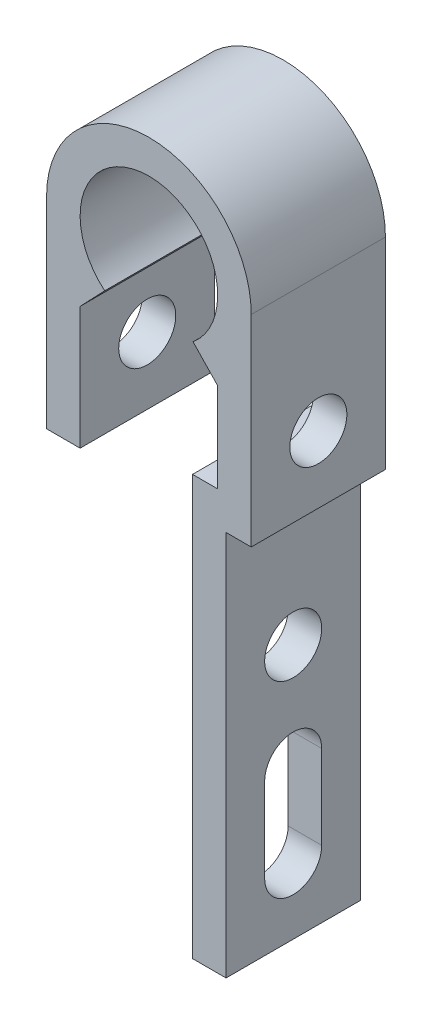
ISO-10303-21;
HEADER;
FILE_DESCRIPTION(('STEP AP214'),'2;1');
FILE_NAME('part.step','',(''),(''),'','','');
FILE_SCHEMA(('AUTOMOTIVE_DESIGN { 1 0 10303 214 1 1 1 1 }'));
ENDSEC;
DATA;
#1=APPLICATION_CONTEXT('core data for automotive mechanical design processes');
#2=APPLICATION_PROTOCOL_DEFINITION('international standard','automotive_design',2000,#1);
#3=PRODUCT_CONTEXT('',#1,'mechanical');
#4=PRODUCT('Part','Part','',(#3));
#5=PRODUCT_RELATED_PRODUCT_CATEGORY('part','',(#4));
#6=PRODUCT_DEFINITION_FORMATION('','',#4);
#7=PRODUCT_DEFINITION_CONTEXT('part definition',#1,'design');
#8=PRODUCT_DEFINITION('design','',#6,#7);
#9=PRODUCT_DEFINITION_SHAPE('','',#8);
#10=(LENGTH_UNIT() NAMED_UNIT(*) SI_UNIT(.MILLI.,.METRE.));
#11=(NAMED_UNIT(*) PLANE_ANGLE_UNIT() SI_UNIT($,.RADIAN.));
#12=(NAMED_UNIT(*) SI_UNIT($,.STERADIAN.) SOLID_ANGLE_UNIT());
#13=UNCERTAINTY_MEASURE_WITH_UNIT(LENGTH_MEASURE(1.E-05),#10,'distance_accuracy_value','');
#14=(GEOMETRIC_REPRESENTATION_CONTEXT(3) GLOBAL_UNCERTAINTY_ASSIGNED_CONTEXT((#13)) GLOBAL_UNIT_ASSIGNED_CONTEXT((#10,
#11,#12)) REPRESENTATION_CONTEXT('',''));
#15=CARTESIAN_POINT('',(0.,0.,0.));
#16=DIRECTION('',(0.,0.,1.));
#17=DIRECTION('',(1.,0.,0.));
#18=AXIS2_PLACEMENT_3D('',#15,#16,#17);
#19=CARTESIAN_POINT('',(-4.1,-12.,8.));
#20=DIRECTION('',(-1.,0.,0.));
#21=DIRECTION('',(0.,0.,1.));
#22=AXIS2_PLACEMENT_3D('',#19,#20,#21);
#23=PLANE('',#22);
#24=CARTESIAN_POINT('',(-4.1,-8.,4.));
#25=DIRECTION('',(-1.,0.,0.));
#26=DIRECTION('',(0.,0.,1.));
#27=AXIS2_PLACEMENT_3D('',#24,#25,#26);
#28=CIRCLE('',#27,1.7);
#29=CARTESIAN_POINT('',(-4.1,-8.,5.7));
#30=VERTEX_POINT('',#29);
#31=EDGE_CURVE('E251',#30,#30,#28,.T.);
#32=ORIENTED_EDGE('',*,*,#31,.T.);
#33=EDGE_LOOP('',(#32));
#34=FACE_BOUND('',#33,.T.);
#35=DIRECTION('',(0.,1.,0.));
#36=VECTOR('',#35,1.);
#37=CARTESIAN_POINT('',(-4.1,-12.,0.));
#38=LINE('',#37,#36);
#39=CARTESIAN_POINT('',(-4.1,-12.,0.));
#40=VERTEX_POINT('',#39);
#41=CARTESIAN_POINT('',(-4.1,-4.67694508196814,0.));
#42=VERTEX_POINT('',#41);
#43=EDGE_CURVE('E248',#40,#42,#38,.T.);
#44=ORIENTED_EDGE('',*,*,#43,.T.);
#45=DIRECTION('',(0.,0.,-1.));
#46=VECTOR('',#45,1.);
#47=CARTESIAN_POINT('',(-4.1,-4.67694508196814,8.));
#48=LINE('',#47,#46);
#49=CARTESIAN_POINT('',(-4.1,-4.67694508196814,8.));
#50=VERTEX_POINT('',#49);
#51=EDGE_CURVE('E160',#50,#42,#48,.T.);
#52=ORIENTED_EDGE('',*,*,#51,.F.);
#53=DIRECTION('',(0.,1.,0.));
#54=VECTOR('',#53,1.);
#55=CARTESIAN_POINT('',(-4.1,-12.,8.));
#56=LINE('',#55,#54);
#57=CARTESIAN_POINT('',(-4.1,-12.,8.));
#58=VERTEX_POINT('',#57);
#59=EDGE_CURVE('E223',#58,#50,#56,.T.);
#60=ORIENTED_EDGE('',*,*,#59,.F.);
#61=DIRECTION('',(0.,0.,-1.));
#62=VECTOR('',#61,1.);
#63=CARTESIAN_POINT('',(-4.1,-12.,8.));
#64=LINE('',#63,#62);
#65=EDGE_CURVE('E217',#58,#40,#64,.T.);
#66=ORIENTED_EDGE('',*,*,#65,.T.);
#67=EDGE_LOOP('',(#44,#52,#60,#66));
#68=FACE_BOUND('',#67,.T.);
#69=ADVANCED_FACE('F33',(#34,#68),#23,.F.);
#70=CARTESIAN_POINT('',(-2.63542919971482,-3.14078221678781,8.));
#71=DIRECTION('',(-0.723771106305428,0.690040133381687,0.));
#72=DIRECTION('',(-0.690040133381687,-0.723771106305428,0.));
#73=AXIS2_PLACEMENT_3D('',#70,#71,#72);
#74=PLANE('',#73);
#75=DIRECTION('',(0.690040133381687,0.723771106305428,0.));
#76=VECTOR('',#75,1.);
#77=CARTESIAN_POINT('',(-2.63542919971482,-3.14078221678781,0.));
#78=LINE('',#77,#76);
#79=CARTESIAN_POINT('',(-2.63542919971481,-3.14078221678781,0.));
#80=VERTEX_POINT('',#79);
#81=EDGE_CURVE('E246',#42,#80,#78,.T.);
#82=ORIENTED_EDGE('',*,*,#81,.T.);
#83=DIRECTION('',(0.,0.,-1.));
#84=VECTOR('',#83,1.);
#85=CARTESIAN_POINT('',(-2.63542919971481,-3.14078221678781,8.));
#86=LINE('',#85,#84);
#87=CARTESIAN_POINT('',(-2.63542919971481,-3.14078221678781,8.));
#88=VERTEX_POINT('',#87);
#89=EDGE_CURVE('E181',#88,#80,#86,.T.);
#90=ORIENTED_EDGE('',*,*,#89,.F.);
#91=DIRECTION('',(0.690040133381687,0.723771106305428,0.));
#92=VECTOR('',#91,1.);
#93=CARTESIAN_POINT('',(-2.63542919971482,-3.14078221678781,8.));
#94=LINE('',#93,#92);
#95=EDGE_CURVE('E275',#50,#88,#94,.T.);
#96=ORIENTED_EDGE('',*,*,#95,.F.);
#97=ORIENTED_EDGE('',*,*,#51,.T.);
#98=EDGE_LOOP('',(#82,#90,#96,#97));
#99=FACE_BOUND('',#98,.T.);
#100=ADVANCED_FACE('F323',(#99),#74,.F.);
#101=CARTESIAN_POINT('',(0.,0.,8.));
#102=DIRECTION('',(0.,0.,-1.));
#103=DIRECTION('',(-1.,0.,0.));
#104=AXIS2_PLACEMENT_3D('',#101,#102,#103);
#105=CYLINDRICAL_SURFACE('',#104,4.1);
#106=CARTESIAN_POINT('',(0.,0.,0.));
#107=DIRECTION('',(0.,0.,-1.));
#108=DIRECTION('',(-1.,0.,0.));
#109=AXIS2_PLACEMENT_3D('',#106,#107,#108);
#110=CIRCLE('',#109,4.1);
#111=CARTESIAN_POINT('',(2.63542919971482,-3.14078221678781,0.));
#112=VERTEX_POINT('',#111);
#113=EDGE_CURVE('E244',#80,#112,#110,.T.);
#114=ORIENTED_EDGE('',*,*,#113,.T.);
#115=DIRECTION('',(0.,0.,-1.));
#116=VECTOR('',#115,1.);
#117=CARTESIAN_POINT('',(2.63542919971482,-3.14078221678781,8.));
#118=LINE('',#117,#116);
#119=CARTESIAN_POINT('',(2.63542919971482,-3.14078221678781,8.));
#120=VERTEX_POINT('',#119);
#121=EDGE_CURVE('E184',#120,#112,#118,.T.);
#122=ORIENTED_EDGE('',*,*,#121,.F.);
#123=CARTESIAN_POINT('',(0.,0.,8.));
#124=DIRECTION('',(0.,0.,-1.));
#125=DIRECTION('',(-1.,0.,0.));
#126=AXIS2_PLACEMENT_3D('',#123,#124,#125);
#127=CIRCLE('',#126,4.1);
#128=EDGE_CURVE('E273',#88,#120,#127,.T.);
#129=ORIENTED_EDGE('',*,*,#128,.F.);
#130=ORIENTED_EDGE('',*,*,#89,.T.);
#131=EDGE_LOOP('',(#114,#122,#129,#130));
#132=FACE_BOUND('',#131,.T.);
#133=ADVANCED_FACE('F328',(#132),#105,.F.);
#134=CARTESIAN_POINT('',(4.1,-4.67694508196814,8.));
#135=DIRECTION('',(0.723771106305428,0.690040133381687,0.));
#136=DIRECTION('',(-0.690040133381688,0.723771106305428,0.));
#137=AXIS2_PLACEMENT_3D('',#134,#135,#136);
#138=PLANE('',#137);
#139=DIRECTION('',(0.690040133381687,-0.723771106305428,0.));
#140=VECTOR('',#139,1.);
#141=CARTESIAN_POINT('',(4.1,-4.67694508196814,0.));
#142=LINE('',#141,#140);
#143=CARTESIAN_POINT('',(4.1,-4.67694508196814,0.));
#144=VERTEX_POINT('',#143);
#145=EDGE_CURVE('E242',#112,#144,#142,.T.);
#146=ORIENTED_EDGE('',*,*,#145,.T.);
#147=DIRECTION('',(0.,0.,-1.));
#148=VECTOR('',#147,1.);
#149=CARTESIAN_POINT('',(4.1,-4.67694508196814,8.));
#150=LINE('',#149,#148);
#151=CARTESIAN_POINT('',(4.1,-4.67694508196814,8.));
#152=VERTEX_POINT('',#151);
#153=EDGE_CURVE('E187',#152,#144,#150,.T.);
#154=ORIENTED_EDGE('',*,*,#153,.F.);
#155=DIRECTION('',(0.690040133381687,-0.723771106305428,0.));
#156=VECTOR('',#155,1.);
#157=CARTESIAN_POINT('',(4.1,-4.67694508196814,8.));
#158=LINE('',#157,#156);
#159=EDGE_CURVE('E271',#120,#152,#158,.T.);
#160=ORIENTED_EDGE('',*,*,#159,.F.);
#161=ORIENTED_EDGE('',*,*,#121,.T.);
#162=EDGE_LOOP('',(#146,#154,#160,#161));
#163=FACE_BOUND('',#162,.T.);
#164=ADVANCED_FACE('F392',(#163),#138,.F.);
#165=CARTESIAN_POINT('',(4.1,-4.67694508196814,8.));
#166=DIRECTION('',(1.,0.,0.));
#167=DIRECTION('',(0.,1.,0.));
#168=AXIS2_PLACEMENT_3D('',#165,#166,#167);
#169=PLANE('',#168);
#170=CARTESIAN_POINT('',(4.1,-8.,4.));
#171=DIRECTION('',(1.,0.,0.));
#172=DIRECTION('',(0.,1.,0.));
#173=AXIS2_PLACEMENT_3D('',#170,#171,#172);
#174=CIRCLE('',#173,1.7);
#175=CARTESIAN_POINT('',(4.1,-6.3,4.));
#176=VERTEX_POINT('',#175);
#177=EDGE_CURVE('E281',#176,#176,#174,.T.);
#178=ORIENTED_EDGE('',*,*,#177,.T.);
#179=EDGE_LOOP('',(#178));
#180=FACE_BOUND('',#179,.T.);
#181=DIRECTION('',(0.,-1.,0.));
#182=VECTOR('',#181,1.);
#183=CARTESIAN_POINT('',(4.1,-4.67694508196814,0.));
#184=LINE('',#183,#182);
#185=CARTESIAN_POINT('',(4.1,-10.,0.));
#186=VERTEX_POINT('',#185);
#187=EDGE_CURVE('E240',#144,#186,#184,.T.);
#188=ORIENTED_EDGE('',*,*,#187,.T.);
#189=DIRECTION('',(0.,0.,-1.));
#190=VECTOR('',#189,1.);
#191=CARTESIAN_POINT('',(4.1,-10.,8.));
#192=LINE('',#191,#190);
#193=CARTESIAN_POINT('',(4.1,-10.,8.));
#194=VERTEX_POINT('',#193);
#195=EDGE_CURVE('E190',#194,#186,#192,.T.);
#196=ORIENTED_EDGE('',*,*,#195,.F.);
#197=DIRECTION('',(0.,-1.,0.));
#198=VECTOR('',#197,1.);
#199=CARTESIAN_POINT('',(4.1,-4.67694508196814,8.));
#200=LINE('',#199,#198);
#201=EDGE_CURVE('E269',#152,#194,#200,.T.);
#202=ORIENTED_EDGE('',*,*,#201,.F.);
#203=ORIENTED_EDGE('',*,*,#153,.T.);
#204=EDGE_LOOP('',(#188,#196,#202,#203));
#205=FACE_BOUND('',#204,.T.);
#206=ADVANCED_FACE('F388',(#180,#205),#169,.F.);
#207=CARTESIAN_POINT('',(4.1,-10.,8.));
#208=DIRECTION('',(0.,-1.,0.));
#209=DIRECTION('',(0.,0.,-1.));
#210=AXIS2_PLACEMENT_3D('',#207,#208,#209);
#211=PLANE('',#210);
#212=DIRECTION('',(-1.,0.,0.));
#213=VECTOR('',#212,1.);
#214=CARTESIAN_POINT('',(4.1,-10.,0.));
#215=LINE('',#214,#213);
#216=CARTESIAN_POINT('',(2.6,-10.,0.));
#217=VERTEX_POINT('',#216);
#218=EDGE_CURVE('E238',#186,#217,#215,.T.);
#219=ORIENTED_EDGE('',*,*,#218,.T.);
#220=DIRECTION('',(0.,0.,-1.));
#221=VECTOR('',#220,1.);
#222=CARTESIAN_POINT('',(2.6,-10.,8.));
#223=LINE('',#222,#221);
#224=CARTESIAN_POINT('',(2.6,-10.,8.));
#225=VERTEX_POINT('',#224);
#226=EDGE_CURVE('E193',#225,#217,#223,.T.);
#227=ORIENTED_EDGE('',*,*,#226,.F.);
#228=DIRECTION('',(-1.,0.,0.));
#229=VECTOR('',#228,1.);
#230=CARTESIAN_POINT('',(4.1,-10.,8.));
#231=LINE('',#230,#229);
#232=EDGE_CURVE('E267',#194,#225,#231,.T.);
#233=ORIENTED_EDGE('',*,*,#232,.F.);
#234=ORIENTED_EDGE('',*,*,#195,.T.);
#235=EDGE_LOOP('',(#219,#227,#233,#234));
#236=FACE_BOUND('',#235,.T.);
#237=ADVANCED_FACE('F383',(#236),#211,.F.);
#238=CARTESIAN_POINT('',(2.6,-10.,8.));
#239=DIRECTION('',(1.,0.,0.));
#240=DIRECTION('',(0.,1.,0.));
#241=AXIS2_PLACEMENT_3D('',#238,#239,#240);
#242=PLANE('',#241);
#243=CARTESIAN_POINT('',(2.6,-19.8,4.));
#244=DIRECTION('',(1.,0.,0.));
#245=DIRECTION('',(0.,1.,0.));
#246=AXIS2_PLACEMENT_3D('',#243,#244,#245);
#247=CIRCLE('',#246,1.7);
#248=CARTESIAN_POINT('',(2.6,-18.1,4.));
#249=VERTEX_POINT('',#248);
#250=EDGE_CURVE('E288',#249,#249,#247,.T.);
#251=ORIENTED_EDGE('',*,*,#250,.T.);
#252=EDGE_LOOP('',(#251));
#253=FACE_BOUND('',#252,.T.);
#254=DIRECTION('',(0.,1.,0.));
#255=VECTOR('',#254,1.);
#256=CARTESIAN_POINT('',(2.6,-10.,2.3));
#257=LINE('',#256,#255);
#258=CARTESIAN_POINT('',(2.6,-31.,2.3));
#259=VERTEX_POINT('',#258);
#260=CARTESIAN_POINT('',(2.6,-26.,2.3));
#261=VERTEX_POINT('',#260);
#262=EDGE_CURVE('E300',#259,#261,#257,.T.);
#263=ORIENTED_EDGE('',*,*,#262,.T.);
#264=CARTESIAN_POINT('',(2.6,-26.,4.));
#265=DIRECTION('',(1.,0.,0.));
#266=DIRECTION('',(0.,1.,0.));
#267=AXIS2_PLACEMENT_3D('',#264,#265,#266);
#268=CIRCLE('',#267,1.7);
#269=CARTESIAN_POINT('',(2.6,-26.,5.7));
#270=VERTEX_POINT('',#269);
#271=EDGE_CURVE('E167',#261,#270,#268,.T.);
#272=ORIENTED_EDGE('',*,*,#271,.T.);
#273=DIRECTION('',(0.,-1.,0.));
#274=VECTOR('',#273,1.);
#275=CARTESIAN_POINT('',(2.6,-10.,5.69999999999999));
#276=LINE('',#275,#274);
#277=CARTESIAN_POINT('',(2.6,-31.,5.7));
#278=VERTEX_POINT('',#277);
#279=EDGE_CURVE('E294',#270,#278,#276,.T.);
#280=ORIENTED_EDGE('',*,*,#279,.T.);
#281=CARTESIAN_POINT('',(2.6,-31.,4.));
#282=DIRECTION('',(1.,0.,0.));
#283=DIRECTION('',(0.,1.,0.));
#284=AXIS2_PLACEMENT_3D('',#281,#282,#283);
#285=CIRCLE('',#284,1.7);
#286=EDGE_CURVE('E297',#278,#259,#285,.T.);
#287=ORIENTED_EDGE('',*,*,#286,.T.);
#288=EDGE_LOOP('',(#263,#272,#280,#287));
#289=FACE_BOUND('',#288,.T.);
#290=DIRECTION('',(0.,-1.,0.));
#291=VECTOR('',#290,1.);
#292=CARTESIAN_POINT('',(2.6,-10.,0.));
#293=LINE('',#292,#291);
#294=CARTESIAN_POINT('',(2.6,-35.,0.));
#295=VERTEX_POINT('',#294);
#296=EDGE_CURVE('E236',#217,#295,#293,.T.);
#297=ORIENTED_EDGE('',*,*,#296,.T.);
#298=DIRECTION('',(0.,0.,-1.));
#299=VECTOR('',#298,1.);
#300=CARTESIAN_POINT('',(2.6,-35.,8.));
#301=LINE('',#300,#299);
#302=CARTESIAN_POINT('',(2.6,-35.,8.));
#303=VERTEX_POINT('',#302);
#304=EDGE_CURVE('E196',#303,#295,#301,.T.);
#305=ORIENTED_EDGE('',*,*,#304,.F.);
#306=DIRECTION('',(0.,-1.,0.));
#307=VECTOR('',#306,1.);
#308=CARTESIAN_POINT('',(2.6,-10.,8.));
#309=LINE('',#308,#307);
#310=EDGE_CURVE('E265',#225,#303,#309,.T.);
#311=ORIENTED_EDGE('',*,*,#310,.F.);
#312=ORIENTED_EDGE('',*,*,#226,.T.);
#313=EDGE_LOOP('',(#297,#305,#311,#312));
#314=FACE_BOUND('',#313,.T.);
#315=ADVANCED_FACE('F307',(#253,#289,#314),#242,.F.);
#316=CARTESIAN_POINT('',(2.6,-35.,8.));
#317=DIRECTION('',(0.,1.,0.));
#318=DIRECTION('',(0.,0.,1.));
#319=AXIS2_PLACEMENT_3D('',#316,#317,#318);
#320=PLANE('',#319);
#321=DIRECTION('',(1.,0.,0.));
#322=VECTOR('',#321,1.);
#323=CARTESIAN_POINT('',(2.6,-35.,0.));
#324=LINE('',#323,#322);
#325=CARTESIAN_POINT('',(4.6,-35.,0.));
#326=VERTEX_POINT('',#325);
#327=EDGE_CURVE('E234',#295,#326,#324,.T.);
#328=ORIENTED_EDGE('',*,*,#327,.T.);
#329=DIRECTION('',(0.,0.,-1.));
#330=VECTOR('',#329,1.);
#331=CARTESIAN_POINT('',(4.6,-35.,8.));
#332=LINE('',#331,#330);
#333=CARTESIAN_POINT('',(4.6,-35.,8.));
#334=VERTEX_POINT('',#333);
#335=EDGE_CURVE('E199',#334,#326,#332,.T.);
#336=ORIENTED_EDGE('',*,*,#335,.F.);
#337=DIRECTION('',(1.,0.,0.));
#338=VECTOR('',#337,1.);
#339=CARTESIAN_POINT('',(2.6,-35.,8.));
#340=LINE('',#339,#338);
#341=EDGE_CURVE('E263',#303,#334,#340,.T.);
#342=ORIENTED_EDGE('',*,*,#341,.F.);
#343=ORIENTED_EDGE('',*,*,#304,.T.);
#344=EDGE_LOOP('',(#328,#336,#342,#343));
#345=FACE_BOUND('',#344,.T.);
#346=ADVANCED_FACE('F376',(#345),#320,.F.);
#347=CARTESIAN_POINT('',(4.6,-12.,8.));
#348=DIRECTION('',(-1.,0.,0.));
#349=DIRECTION('',(0.,-1.,0.));
#350=AXIS2_PLACEMENT_3D('',#347,#348,#349);
#351=PLANE('',#350);
#352=CARTESIAN_POINT('',(4.6,-19.8,4.));
#353=DIRECTION('',(-1.,0.,0.));
#354=DIRECTION('',(0.,-1.,0.));
#355=AXIS2_PLACEMENT_3D('',#352,#353,#354);
#356=CIRCLE('',#355,1.7);
#357=CARTESIAN_POINT('',(4.6,-21.5,4.));
#358=VERTEX_POINT('',#357);
#359=EDGE_CURVE('E36',#358,#358,#356,.T.);
#360=ORIENTED_EDGE('',*,*,#359,.T.);
#361=EDGE_LOOP('',(#360));
#362=FACE_BOUND('',#361,.T.);
#363=DIRECTION('',(0.,1.,0.));
#364=VECTOR('',#363,1.);
#365=CARTESIAN_POINT('',(4.6,-12.,5.69999999999999));
#366=LINE('',#365,#364);
#367=CARTESIAN_POINT('',(4.6,-31.,5.7));
#368=VERTEX_POINT('',#367);
#369=CARTESIAN_POINT('',(4.6,-26.,5.7));
#370=VERTEX_POINT('',#369);
#371=EDGE_CURVE('E41',#368,#370,#366,.T.);
#372=ORIENTED_EDGE('',*,*,#371,.T.);
#373=CARTESIAN_POINT('',(4.6,-26.,4.));
#374=DIRECTION('',(-1.,0.,0.));
#375=DIRECTION('',(0.,-1.,0.));
#376=AXIS2_PLACEMENT_3D('',#373,#374,#375);
#377=CIRCLE('',#376,1.7);
#378=CARTESIAN_POINT('',(4.6,-26.,2.3));
#379=VERTEX_POINT('',#378);
#380=EDGE_CURVE('E11',#370,#379,#377,.T.);
#381=ORIENTED_EDGE('',*,*,#380,.T.);
#382=DIRECTION('',(0.,-1.,0.));
#383=VECTOR('',#382,1.);
#384=CARTESIAN_POINT('',(4.6,-12.,2.3));
#385=LINE('',#384,#383);
#386=CARTESIAN_POINT('',(4.6,-31.,2.3));
#387=VERTEX_POINT('',#386);
#388=EDGE_CURVE('E155',#379,#387,#385,.T.);
#389=ORIENTED_EDGE('',*,*,#388,.T.);
#390=CARTESIAN_POINT('',(4.6,-31.,4.));
#391=DIRECTION('',(-1.,0.,0.));
#392=DIRECTION('',(0.,-1.,0.));
#393=AXIS2_PLACEMENT_3D('',#390,#391,#392);
#394=CIRCLE('',#393,1.7);
#395=EDGE_CURVE('E159',#387,#368,#394,.T.);
#396=ORIENTED_EDGE('',*,*,#395,.T.);
#397=EDGE_LOOP('',(#372,#381,#389,#396));
#398=FACE_BOUND('',#397,.T.);
#399=DIRECTION('',(0.,1.,0.));
#400=VECTOR('',#399,1.);
#401=CARTESIAN_POINT('',(4.6,-12.,0.));
#402=LINE('',#401,#400);
#403=CARTESIAN_POINT('',(4.6,-12.,0.));
#404=VERTEX_POINT('',#403);
#405=EDGE_CURVE('E232',#326,#404,#402,.T.);
#406=ORIENTED_EDGE('',*,*,#405,.T.);
#407=DIRECTION('',(0.,0.,-1.));
#408=VECTOR('',#407,1.);
#409=CARTESIAN_POINT('',(4.6,-12.,8.));
#410=LINE('',#409,#408);
#411=CARTESIAN_POINT('',(4.6,-12.,8.));
#412=VERTEX_POINT('',#411);
#413=EDGE_CURVE('E202',#412,#404,#410,.T.);
#414=ORIENTED_EDGE('',*,*,#413,.F.);
#415=DIRECTION('',(0.,1.,0.));
#416=VECTOR('',#415,1.);
#417=CARTESIAN_POINT('',(4.6,-12.,8.));
#418=LINE('',#417,#416);
#419=EDGE_CURVE('E261',#334,#412,#418,.T.);
#420=ORIENTED_EDGE('',*,*,#419,.F.);
#421=ORIENTED_EDGE('',*,*,#335,.T.);
#422=EDGE_LOOP('',(#406,#414,#420,#421));
#423=FACE_BOUND('',#422,.T.);
#424=ADVANCED_FACE('F171',(#362,#398,#423),#351,.F.);
#425=CARTESIAN_POINT('',(6.1,-12.,8.));
#426=DIRECTION('',(0.,1.,0.));
#427=DIRECTION('',(0.,0.,1.));
#428=AXIS2_PLACEMENT_3D('',#425,#426,#427);
#429=PLANE('',#428);
#430=DIRECTION('',(1.,0.,0.));
#431=VECTOR('',#430,1.);
#432=CARTESIAN_POINT('',(6.1,-12.,0.));
#433=LINE('',#432,#431);
#434=CARTESIAN_POINT('',(6.1,-12.,0.));
#435=VERTEX_POINT('',#434);
#436=EDGE_CURVE('E230',#404,#435,#433,.T.);
#437=ORIENTED_EDGE('',*,*,#436,.T.);
#438=DIRECTION('',(0.,0.,-1.));
#439=VECTOR('',#438,1.);
#440=CARTESIAN_POINT('',(6.1,-12.,8.));
#441=LINE('',#440,#439);
#442=CARTESIAN_POINT('',(6.1,-12.,8.));
#443=VERTEX_POINT('',#442);
#444=EDGE_CURVE('E205',#443,#435,#441,.T.);
#445=ORIENTED_EDGE('',*,*,#444,.F.);
#446=DIRECTION('',(1.,0.,0.));
#447=VECTOR('',#446,1.);
#448=CARTESIAN_POINT('',(6.1,-12.,8.));
#449=LINE('',#448,#447);
#450=EDGE_CURVE('E259',#412,#443,#449,.T.);
#451=ORIENTED_EDGE('',*,*,#450,.F.);
#452=ORIENTED_EDGE('',*,*,#413,.T.);
#453=EDGE_LOOP('',(#437,#445,#451,#452));
#454=FACE_BOUND('',#453,.T.);
#455=ADVANCED_FACE('F367',(#454),#429,.F.);
#456=CARTESIAN_POINT('',(6.1,0.,8.));
#457=DIRECTION('',(-1.,0.,0.));
#458=DIRECTION('',(0.,0.,1.));
#459=AXIS2_PLACEMENT_3D('',#456,#457,#458);
#460=PLANE('',#459);
#461=CARTESIAN_POINT('',(6.1,-8.,4.));
#462=DIRECTION('',(-1.,0.,0.));
#463=DIRECTION('',(0.,0.,1.));
#464=AXIS2_PLACEMENT_3D('',#461,#462,#463);
#465=CIRCLE('',#464,1.7);
#466=CARTESIAN_POINT('',(6.1,-8.,5.7));
#467=VERTEX_POINT('',#466);
#468=EDGE_CURVE('E284',#467,#467,#465,.T.);
#469=ORIENTED_EDGE('',*,*,#468,.T.);
#470=EDGE_LOOP('',(#469));
#471=FACE_BOUND('',#470,.T.);
#472=DIRECTION('',(0.,1.,0.));
#473=VECTOR('',#472,1.);
#474=CARTESIAN_POINT('',(6.1,0.,0.));
#475=LINE('',#474,#473);
#476=CARTESIAN_POINT('',(6.1,0.,0.));
#477=VERTEX_POINT('',#476);
#478=EDGE_CURVE('E228',#435,#477,#475,.T.);
#479=ORIENTED_EDGE('',*,*,#478,.T.);
#480=DIRECTION('',(0.,0.,-1.));
#481=VECTOR('',#480,1.);
#482=CARTESIAN_POINT('',(6.1,0.,8.));
#483=LINE('',#482,#481);
#484=CARTESIAN_POINT('',(6.1,0.,8.));
#485=VERTEX_POINT('',#484);
#486=EDGE_CURVE('E208',#485,#477,#483,.T.);
#487=ORIENTED_EDGE('',*,*,#486,.F.);
#488=DIRECTION('',(0.,1.,0.));
#489=VECTOR('',#488,1.);
#490=CARTESIAN_POINT('',(6.1,0.,8.));
#491=LINE('',#490,#489);
#492=EDGE_CURVE('E257',#443,#485,#491,.T.);
#493=ORIENTED_EDGE('',*,*,#492,.F.);
#494=ORIENTED_EDGE('',*,*,#444,.T.);
#495=EDGE_LOOP('',(#479,#487,#493,#494));
#496=FACE_BOUND('',#495,.T.);
#497=ADVANCED_FACE('F363',(#471,#496),#460,.F.);
#498=CARTESIAN_POINT('',(0.,0.,8.));
#499=DIRECTION('',(0.,0.,-1.));
#500=DIRECTION('',(-1.,0.,0.));
#501=AXIS2_PLACEMENT_3D('',#498,#499,#500);
#502=CYLINDRICAL_SURFACE('',#501,6.1);
#503=CARTESIAN_POINT('',(0.,0.,0.));
#504=DIRECTION('',(0.,0.,1.));
#505=DIRECTION('',(-1.,0.,0.));
#506=AXIS2_PLACEMENT_3D('',#503,#504,#505);
#507=CIRCLE('',#506,6.1);
#508=CARTESIAN_POINT('',(-6.1,0.,0.));
#509=VERTEX_POINT('',#508);
#510=EDGE_CURVE('E226',#477,#509,#507,.T.);
#511=ORIENTED_EDGE('',*,*,#510,.T.);
#512=DIRECTION('',(0.,0.,-1.));
#513=VECTOR('',#512,1.);
#514=CARTESIAN_POINT('',(-6.1,0.,8.));
#515=LINE('',#514,#513);
#516=CARTESIAN_POINT('',(-6.1,0.,8.));
#517=VERTEX_POINT('',#516);
#518=EDGE_CURVE('E211',#517,#509,#515,.T.);
#519=ORIENTED_EDGE('',*,*,#518,.F.);
#520=CARTESIAN_POINT('',(0.,0.,8.));
#521=DIRECTION('',(0.,0.,1.));
#522=DIRECTION('',(-1.,0.,0.));
#523=AXIS2_PLACEMENT_3D('',#520,#521,#522);
#524=CIRCLE('',#523,6.1);
#525=EDGE_CURVE('E255',#485,#517,#524,.T.);
#526=ORIENTED_EDGE('',*,*,#525,.F.);
#527=ORIENTED_EDGE('',*,*,#486,.T.);
#528=EDGE_LOOP('',(#511,#519,#526,#527));
#529=FACE_BOUND('',#528,.T.);
#530=ADVANCED_FACE('F358',(#529),#502,.T.);
#531=CARTESIAN_POINT('',(-6.1,-12.,8.));
#532=DIRECTION('',(1.,0.,0.));
#533=DIRECTION('',(0.,1.,0.));
#534=AXIS2_PLACEMENT_3D('',#531,#532,#533);
#535=PLANE('',#534);
#536=CARTESIAN_POINT('',(-6.1,-8.,4.));
#537=DIRECTION('',(-1.,0.,0.));
#538=DIRECTION('',(0.,0.,1.));
#539=AXIS2_PLACEMENT_3D('',#536,#537,#538);
#540=CIRCLE('',#539,1.7);
#541=CARTESIAN_POINT('',(-6.1,-8.,5.7));
#542=VERTEX_POINT('',#541);
#543=EDGE_CURVE('E285',#542,#542,#540,.T.);
#544=ORIENTED_EDGE('',*,*,#543,.F.);
#545=EDGE_LOOP('',(#544));
#546=FACE_BOUND('',#545,.T.);
#547=DIRECTION('',(0.,-1.,0.));
#548=VECTOR('',#547,1.);
#549=CARTESIAN_POINT('',(-6.1,-12.,0.));
#550=LINE('',#549,#548);
#551=CARTESIAN_POINT('',(-6.1,-12.,0.));
#552=VERTEX_POINT('',#551);
#553=EDGE_CURVE('E224',#509,#552,#550,.T.);
#554=ORIENTED_EDGE('',*,*,#553,.T.);
#555=DIRECTION('',(0.,0.,-1.));
#556=VECTOR('',#555,1.);
#557=CARTESIAN_POINT('',(-6.1,-12.,8.));
#558=LINE('',#557,#556);
#559=CARTESIAN_POINT('',(-6.1,-12.,8.));
#560=VERTEX_POINT('',#559);
#561=EDGE_CURVE('E214',#560,#552,#558,.T.);
#562=ORIENTED_EDGE('',*,*,#561,.F.);
#563=DIRECTION('',(0.,-1.,0.));
#564=VECTOR('',#563,1.);
#565=CARTESIAN_POINT('',(-6.1,-12.,8.));
#566=LINE('',#565,#564);
#567=EDGE_CURVE('E253',#517,#560,#566,.T.);
#568=ORIENTED_EDGE('',*,*,#567,.F.);
#569=ORIENTED_EDGE('',*,*,#518,.T.);
#570=EDGE_LOOP('',(#554,#562,#568,#569));
#571=FACE_BOUND('',#570,.T.);
#572=ADVANCED_FACE('F352',(#546,#571),#535,.F.);
#573=CARTESIAN_POINT('',(-6.1,-12.,8.));
#574=DIRECTION('',(0.,1.,0.));
#575=DIRECTION('',(0.,0.,1.));
#576=AXIS2_PLACEMENT_3D('',#573,#574,#575);
#577=PLANE('',#576);
#578=DIRECTION('',(1.,0.,0.));
#579=VECTOR('',#578,1.);
#580=CARTESIAN_POINT('',(-6.1,-12.,0.));
#581=LINE('',#580,#579);
#582=EDGE_CURVE('E221',#552,#40,#581,.T.);
#583=ORIENTED_EDGE('',*,*,#582,.T.);
#584=ORIENTED_EDGE('',*,*,#65,.F.);
#585=DIRECTION('',(1.,0.,0.));
#586=VECTOR('',#585,1.);
#587=CARTESIAN_POINT('',(-6.1,-12.,8.));
#588=LINE('',#587,#586);
#589=EDGE_CURVE('E220',#560,#58,#588,.T.);
#590=ORIENTED_EDGE('',*,*,#589,.F.);
#591=ORIENTED_EDGE('',*,*,#561,.T.);
#592=EDGE_LOOP('',(#583,#584,#590,#591));
#593=FACE_BOUND('',#592,.T.);
#594=ADVANCED_FACE('F350',(#593),#577,.F.);
#595=CARTESIAN_POINT('',(0.,0.,8.));
#596=DIRECTION('',(0.,0.,-1.));
#597=DIRECTION('',(-1.,0.,0.));
#598=AXIS2_PLACEMENT_3D('',#595,#596,#597);
#599=PLANE('',#598);
#600=ORIENTED_EDGE('',*,*,#59,.T.);
#601=ORIENTED_EDGE('',*,*,#95,.T.);
#602=ORIENTED_EDGE('',*,*,#128,.T.);
#603=ORIENTED_EDGE('',*,*,#159,.T.);
#604=ORIENTED_EDGE('',*,*,#201,.T.);
#605=ORIENTED_EDGE('',*,*,#232,.T.);
#606=ORIENTED_EDGE('',*,*,#310,.T.);
#607=ORIENTED_EDGE('',*,*,#341,.T.);
#608=ORIENTED_EDGE('',*,*,#419,.T.);
#609=ORIENTED_EDGE('',*,*,#450,.T.);
#610=ORIENTED_EDGE('',*,*,#492,.T.);
#611=ORIENTED_EDGE('',*,*,#525,.T.);
#612=ORIENTED_EDGE('',*,*,#567,.T.);
#613=ORIENTED_EDGE('',*,*,#589,.T.);
#614=EDGE_LOOP('',(#600,#601,#602,#603,#604,#605,#606,#607,#608,#609,#610,#611,#612,#613));
#615=FACE_BOUND('',#614,.T.);
#616=ADVANCED_FACE('F345',(#615),#599,.F.);
#617=CARTESIAN_POINT('',(0.,0.,0.));
#618=DIRECTION('',(0.,0.,-1.));
#619=DIRECTION('',(-1.,0.,0.));
#620=AXIS2_PLACEMENT_3D('',#617,#618,#619);
#621=PLANE('',#620);
#622=ORIENTED_EDGE('',*,*,#43,.F.);
#623=ORIENTED_EDGE('',*,*,#582,.F.);
#624=ORIENTED_EDGE('',*,*,#553,.F.);
#625=ORIENTED_EDGE('',*,*,#510,.F.);
#626=ORIENTED_EDGE('',*,*,#478,.F.);
#627=ORIENTED_EDGE('',*,*,#436,.F.);
#628=ORIENTED_EDGE('',*,*,#405,.F.);
#629=ORIENTED_EDGE('',*,*,#327,.F.);
#630=ORIENTED_EDGE('',*,*,#296,.F.);
#631=ORIENTED_EDGE('',*,*,#218,.F.);
#632=ORIENTED_EDGE('',*,*,#187,.F.);
#633=ORIENTED_EDGE('',*,*,#145,.F.);
#634=ORIENTED_EDGE('',*,*,#113,.F.);
#635=ORIENTED_EDGE('',*,*,#81,.F.);
#636=EDGE_LOOP('',(#622,#623,#624,#625,#626,#627,#628,#629,#630,#631,#632,#633,#634,#635));
#637=FACE_BOUND('',#636,.T.);
#638=ADVANCED_FACE('F338',(#637),#621,.T.);
#639=CARTESIAN_POINT('',(6.1,-8.,4.));
#640=DIRECTION('',(-1.,0.,0.));
#641=DIRECTION('',(0.,0.,1.));
#642=AXIS2_PLACEMENT_3D('',#639,#640,#641);
#643=CYLINDRICAL_SURFACE('',#642,1.7);
#644=ORIENTED_EDGE('',*,*,#543,.T.);
#645=EDGE_LOOP('',(#644));
#646=FACE_BOUND('',#645,.T.);
#647=ORIENTED_EDGE('',*,*,#31,.F.);
#648=EDGE_LOOP('',(#647));
#649=FACE_BOUND('',#648,.T.);
#650=ADVANCED_FACE('F429',(#646,#649),#643,.F.);
#651=ORIENTED_EDGE('',*,*,#468,.F.);
#652=EDGE_LOOP('',(#651));
#653=FACE_BOUND('',#652,.T.);
#654=ORIENTED_EDGE('',*,*,#177,.F.);
#655=EDGE_LOOP('',(#654));
#656=FACE_BOUND('',#655,.T.);
#657=ADVANCED_FACE('F319',(#653,#656),#643,.F.);
#658=CARTESIAN_POINT('',(6.1,-26.,4.));
#659=DIRECTION('',(-1.,0.,0.));
#660=DIRECTION('',(0.,0.,1.));
#661=AXIS2_PLACEMENT_3D('',#658,#659,#660);
#662=CYLINDRICAL_SURFACE('',#661,1.7);
#663=DIRECTION('',(-1.,0.,0.));
#664=VECTOR('',#663,1.);
#665=CARTESIAN_POINT('',(6.1,-26.,2.3));
#666=LINE('',#665,#664);
#667=EDGE_CURVE('E48',#379,#261,#666,.T.);
#668=ORIENTED_EDGE('',*,*,#667,.F.);
#669=ORIENTED_EDGE('',*,*,#380,.F.);
#670=DIRECTION('',(-1.,0.,0.));
#671=VECTOR('',#670,1.);
#672=CARTESIAN_POINT('',(6.1,-26.,5.7));
#673=LINE('',#672,#671);
#674=EDGE_CURVE('E301',#370,#270,#673,.T.);
#675=ORIENTED_EDGE('',*,*,#674,.T.);
#676=ORIENTED_EDGE('',*,*,#271,.F.);
#677=EDGE_LOOP('',(#668,#669,#675,#676));
#678=FACE_BOUND('',#677,.T.);
#679=ADVANCED_FACE('F163',(#678),#662,.F.);
#680=CARTESIAN_POINT('',(6.1,-26.,5.7));
#681=DIRECTION('',(0.,0.,1.));
#682=DIRECTION('',(0.,-1.,0.));
#683=AXIS2_PLACEMENT_3D('',#680,#681,#682);
#684=PLANE('',#683);
#685=ORIENTED_EDGE('',*,*,#674,.F.);
#686=ORIENTED_EDGE('',*,*,#371,.F.);
#687=DIRECTION('',(-1.,0.,0.));
#688=VECTOR('',#687,1.);
#689=CARTESIAN_POINT('',(6.1,-31.,5.7));
#690=LINE('',#689,#688);
#691=EDGE_CURVE('E304',#368,#278,#690,.T.);
#692=ORIENTED_EDGE('',*,*,#691,.T.);
#693=ORIENTED_EDGE('',*,*,#279,.F.);
#694=EDGE_LOOP('',(#685,#686,#692,#693));
#695=FACE_BOUND('',#694,.T.);
#696=ADVANCED_FACE('F311',(#695),#684,.F.);
#697=CARTESIAN_POINT('',(6.1,-31.,4.));
#698=DIRECTION('',(-1.,0.,0.));
#699=DIRECTION('',(0.,0.,1.));
#700=AXIS2_PLACEMENT_3D('',#697,#698,#699);
#701=CYLINDRICAL_SURFACE('',#700,1.7);
#702=ORIENTED_EDGE('',*,*,#691,.F.);
#703=ORIENTED_EDGE('',*,*,#395,.F.);
#704=DIRECTION('',(-1.,0.,0.));
#705=VECTOR('',#704,1.);
#706=CARTESIAN_POINT('',(6.1,-31.,2.3));
#707=LINE('',#706,#705);
#708=EDGE_CURVE('E53',#387,#259,#707,.T.);
#709=ORIENTED_EDGE('',*,*,#708,.T.);
#710=ORIENTED_EDGE('',*,*,#286,.F.);
#711=EDGE_LOOP('',(#702,#703,#709,#710));
#712=FACE_BOUND('',#711,.T.);
#713=ADVANCED_FACE('F310',(#712),#701,.F.);
#714=CARTESIAN_POINT('',(6.1,-26.,2.3));
#715=DIRECTION('',(0.,0.,-1.));
#716=DIRECTION('',(0.,1.,0.));
#717=AXIS2_PLACEMENT_3D('',#714,#715,#716);
#718=PLANE('',#717);
#719=ORIENTED_EDGE('',*,*,#708,.F.);
#720=ORIENTED_EDGE('',*,*,#388,.F.);
#721=ORIENTED_EDGE('',*,*,#667,.T.);
#722=ORIENTED_EDGE('',*,*,#262,.F.);
#723=EDGE_LOOP('',(#719,#720,#721,#722));
#724=FACE_BOUND('',#723,.T.);
#725=ADVANCED_FACE('F156',(#724),#718,.F.);
#726=CARTESIAN_POINT('',(6.1,-19.8,4.));
#727=DIRECTION('',(-1.,0.,0.));
#728=DIRECTION('',(0.,0.,1.));
#729=AXIS2_PLACEMENT_3D('',#726,#727,#728);
#730=CYLINDRICAL_SURFACE('',#729,1.7);
#731=ORIENTED_EDGE('',*,*,#359,.F.);
#732=EDGE_LOOP('',(#731));
#733=FACE_BOUND('',#732,.T.);
#734=ORIENTED_EDGE('',*,*,#250,.F.);
#735=EDGE_LOOP('',(#734));
#736=FACE_BOUND('',#735,.T.);
#737=ADVANCED_FACE('F436',(#733,#736),#730,.F.);
#738=CLOSED_SHELL('',(#69,#100,#133,#164,#206,#237,#315,#346,#424,#455,#497,#530,#572,#594,#616,
#638,#650,#657,#679,#696,#713,#725,#737));
#739=MANIFOLD_SOLID_BREP('B2',#738);
#740=ADVANCED_BREP_SHAPE_REPRESENTATION('',(#18,#739),#14);
#741=SHAPE_DEFINITION_REPRESENTATION(#9,#740);
ENDSEC;
END-ISO-10303-21;
